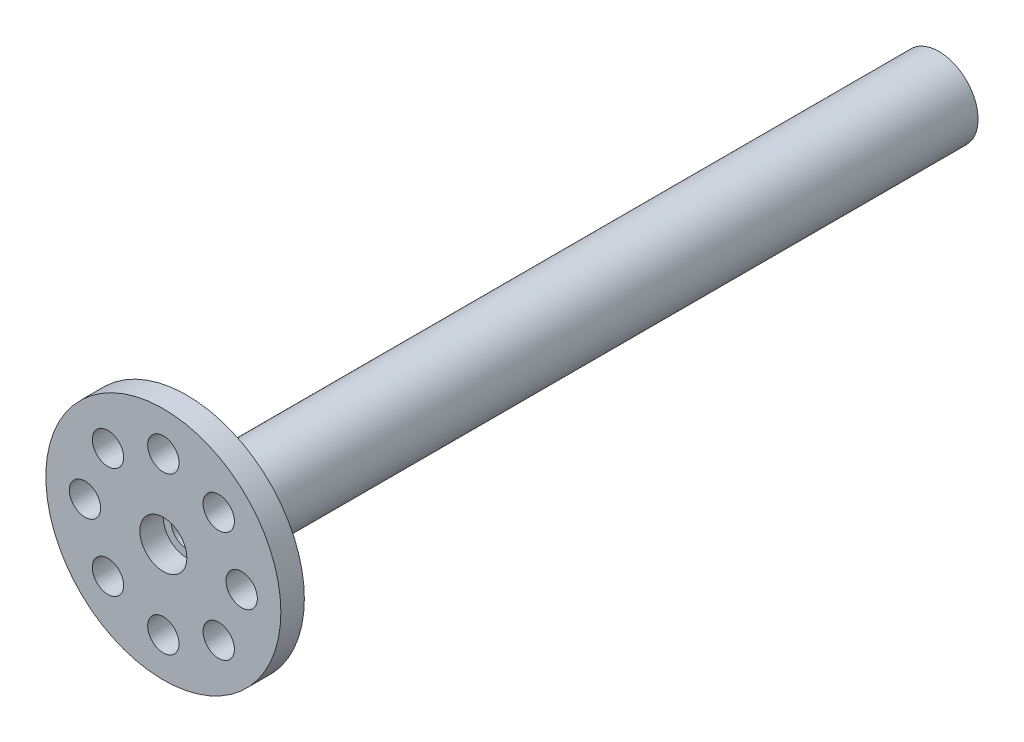
ISO-10303-21;
HEADER;
FILE_DESCRIPTION(('STEP AP214'),'2;1');
FILE_NAME('part.step','',(''),(''),'','','');
FILE_SCHEMA(('AUTOMOTIVE_DESIGN { 1 0 10303 214 1 1 1 1 }'));
ENDSEC;
DATA;
#1=APPLICATION_CONTEXT('core data for automotive mechanical design processes');
#2=APPLICATION_PROTOCOL_DEFINITION('international standard','automotive_design',2000,#1);
#3=PRODUCT_CONTEXT('',#1,'mechanical');
#4=PRODUCT('Part','Part','',(#3));
#5=PRODUCT_RELATED_PRODUCT_CATEGORY('part','',(#4));
#6=PRODUCT_DEFINITION_FORMATION('','',#4);
#7=PRODUCT_DEFINITION_CONTEXT('part definition',#1,'design');
#8=PRODUCT_DEFINITION('design','',#6,#7);
#9=PRODUCT_DEFINITION_SHAPE('','',#8);
#10=(LENGTH_UNIT() NAMED_UNIT(*) SI_UNIT(.MILLI.,.METRE.));
#11=(NAMED_UNIT(*) PLANE_ANGLE_UNIT() SI_UNIT($,.RADIAN.));
#12=(NAMED_UNIT(*) SI_UNIT($,.STERADIAN.) SOLID_ANGLE_UNIT());
#13=UNCERTAINTY_MEASURE_WITH_UNIT(LENGTH_MEASURE(1.E-05),#10,'distance_accuracy_value','');
#14=(GEOMETRIC_REPRESENTATION_CONTEXT(3) GLOBAL_UNCERTAINTY_ASSIGNED_CONTEXT((#13)) GLOBAL_UNIT_ASSIGNED_CONTEXT((#10,
#11,#12)) REPRESENTATION_CONTEXT('',''));
#15=CARTESIAN_POINT('',(0.,0.,0.));
#16=DIRECTION('',(0.,0.,1.));
#17=DIRECTION('',(1.,0.,0.));
#18=AXIS2_PLACEMENT_3D('',#15,#16,#17);
#19=CARTESIAN_POINT('',(0.,0.,99.));
#20=DIRECTION('',(0.,0.,-1.));
#21=DIRECTION('',(-1.,0.,0.));
#22=AXIS2_PLACEMENT_3D('',#19,#20,#21);
#23=CYLINDRICAL_SURFACE('',#22,2.);
#24=CARTESIAN_POINT('',(0.,0.,0.));
#25=DIRECTION('',(0.,0.,-1.));
#26=DIRECTION('',(-1.,0.,0.));
#27=AXIS2_PLACEMENT_3D('',#24,#25,#26);
#28=CIRCLE('',#27,2.);
#29=CARTESIAN_POINT('',(-2.,0.,0.));
#30=VERTEX_POINT('',#29);
#31=EDGE_CURVE('E107',#30,#30,#28,.T.);
#32=ORIENTED_EDGE('',*,*,#31,.T.);
#33=EDGE_LOOP('',(#32));
#34=FACE_BOUND('',#33,.T.);
#35=CARTESIAN_POINT('',(0.,0.,96.));
#36=DIRECTION('',(0.,0.,1.));
#37=DIRECTION('',(1.,0.,0.));
#38=AXIS2_PLACEMENT_3D('',#35,#36,#37);
#39=CIRCLE('',#38,2.);
#40=CARTESIAN_POINT('',(2.,0.,96.));
#41=VERTEX_POINT('',#40);
#42=EDGE_CURVE('E39',#41,#41,#39,.F.);
#43=ORIENTED_EDGE('',*,*,#42,.F.);
#44=EDGE_LOOP('',(#43));
#45=FACE_BOUND('',#44,.T.);
#46=ADVANCED_FACE('F35',(#34,#45),#23,.F.);
#47=CARTESIAN_POINT('',(0.,0.,93.));
#48=DIRECTION('',(0.,0.,-1.));
#49=DIRECTION('',(-1.,0.,0.));
#50=AXIS2_PLACEMENT_3D('',#47,#48,#49);
#51=CYLINDRICAL_SURFACE('',#50,5.);
#52=CARTESIAN_POINT('',(0.,0.,93.));
#53=DIRECTION('',(0.,0.,1.));
#54=DIRECTION('',(1.,0.,0.));
#55=AXIS2_PLACEMENT_3D('',#52,#53,#54);
#56=CIRCLE('',#55,5.);
#57=CARTESIAN_POINT('',(-5.,0.,93.));
#58=VERTEX_POINT('',#57);
#59=EDGE_CURVE('E10',#58,#58,#56,.T.);
#60=CARTESIAN_POINT('',(0.,0.,0.));
#61=DIRECTION('',(0.,0.,1.));
#62=DIRECTION('',(1.,0.,0.));
#63=AXIS2_PLACEMENT_3D('',#60,#61,#62);
#64=CIRCLE('',#63,5.);
#65=CARTESIAN_POINT('',(-5.,0.,0.));
#66=VERTEX_POINT('',#65);
#67=EDGE_CURVE('E43',#66,#66,#64,.T.);
#68=CARTESIAN_POINT('',(-5.,0.,93.));
#69=CARTESIAN_POINT('',(-5.,0.,92.03125));
#70=CARTESIAN_POINT('',(-5.,0.,91.0625));
#71=CARTESIAN_POINT('',(-5.,0.,89.125));
#72=CARTESIAN_POINT('',(-5.,0.,88.15625));
#73=CARTESIAN_POINT('',(-5.,0.,86.21875));
#74=CARTESIAN_POINT('',(-5.,0.,85.25));
#75=CARTESIAN_POINT('',(-5.,0.,83.3125));
#76=CARTESIAN_POINT('',(-5.,0.,82.34375));
#77=CARTESIAN_POINT('',(-5.,0.,80.40625));
#78=CARTESIAN_POINT('',(-5.,0.,79.4375));
#79=CARTESIAN_POINT('',(-5.,0.,77.5));
#80=CARTESIAN_POINT('',(-5.,0.,76.53125));
#81=CARTESIAN_POINT('',(-5.,0.,74.59375));
#82=CARTESIAN_POINT('',(-5.,0.,73.625));
#83=CARTESIAN_POINT('',(-5.,0.,71.6875));
#84=CARTESIAN_POINT('',(-5.,0.,70.71875));
#85=CARTESIAN_POINT('',(-5.,0.,68.78125));
#86=CARTESIAN_POINT('',(-5.,0.,67.8125));
#87=CARTESIAN_POINT('',(-5.,0.,65.875));
#88=CARTESIAN_POINT('',(-5.,0.,64.90625));
#89=CARTESIAN_POINT('',(-5.,0.,62.96875));
#90=CARTESIAN_POINT('',(-5.,0.,62.));
#91=CARTESIAN_POINT('',(-5.,0.,60.0625));
#92=CARTESIAN_POINT('',(-5.,0.,59.09375));
#93=CARTESIAN_POINT('',(-5.,0.,57.15625));
#94=CARTESIAN_POINT('',(-5.,0.,56.1875));
#95=CARTESIAN_POINT('',(-5.,0.,54.25));
#96=CARTESIAN_POINT('',(-5.,0.,53.28125));
#97=CARTESIAN_POINT('',(-5.,0.,51.34375));
#98=CARTESIAN_POINT('',(-5.,0.,50.375));
#99=CARTESIAN_POINT('',(-5.,0.,48.4375));
#100=CARTESIAN_POINT('',(-5.,0.,47.46875));
#101=CARTESIAN_POINT('',(-5.,0.,45.53125));
#102=CARTESIAN_POINT('',(-5.,0.,44.5625));
#103=CARTESIAN_POINT('',(-5.,0.,42.625));
#104=CARTESIAN_POINT('',(-5.,0.,41.65625));
#105=CARTESIAN_POINT('',(-5.,0.,39.71875));
#106=CARTESIAN_POINT('',(-5.,0.,38.75));
#107=CARTESIAN_POINT('',(-5.,0.,36.8125));
#108=CARTESIAN_POINT('',(-5.,0.,35.84375));
#109=CARTESIAN_POINT('',(-5.,0.,33.90625));
#110=CARTESIAN_POINT('',(-5.,0.,32.9375));
#111=CARTESIAN_POINT('',(-5.,0.,31.));
#112=CARTESIAN_POINT('',(-5.,0.,30.03125));
#113=CARTESIAN_POINT('',(-5.,0.,28.09375));
#114=CARTESIAN_POINT('',(-5.,0.,27.125));
#115=CARTESIAN_POINT('',(-5.,0.,25.1875));
#116=CARTESIAN_POINT('',(-5.,0.,24.21875));
#117=CARTESIAN_POINT('',(-5.,0.,22.28125));
#118=CARTESIAN_POINT('',(-5.,0.,21.3125));
#119=CARTESIAN_POINT('',(-5.,0.,19.375));
#120=CARTESIAN_POINT('',(-5.,0.,18.40625));
#121=CARTESIAN_POINT('',(-5.,0.,16.46875));
#122=CARTESIAN_POINT('',(-5.,0.,15.5));
#123=CARTESIAN_POINT('',(-5.,0.,13.5625));
#124=CARTESIAN_POINT('',(-5.,0.,12.59375));
#125=CARTESIAN_POINT('',(-5.,0.,10.65625));
#126=CARTESIAN_POINT('',(-5.,0.,9.68749999999998));
#127=CARTESIAN_POINT('',(-5.,0.,7.74999999999998));
#128=CARTESIAN_POINT('',(-5.,0.,6.78124999999998));
#129=CARTESIAN_POINT('',(-5.,0.,4.84374999999998));
#130=CARTESIAN_POINT('',(-5.,0.,3.87499999999999));
#131=CARTESIAN_POINT('',(-5.,0.,1.93749999999999));
#132=CARTESIAN_POINT('',(-5.,0.,0.968749999999985));
#133=CARTESIAN_POINT('',(-5.,0.,0.));
#134=B_SPLINE_CURVE_WITH_KNOTS('',3,(#68,#69,#70,#71,#72,#73,#74,#75,#76,#77,#78,#79,#80,#81,
#82,#83,#84,#85,#86,#87,#88,#89,#90,#91,#92,#93,#94,#95,#96,#97,#98,#99,#100,#101,#102,#103,
#104,#105,#106,#107,#108,#109,#110,#111,#112,#113,#114,#115,#116,#117,#118,#119,#120,#121,#122,
#123,#124,#125,#126,#127,#128,#129,#130,#131,#132,#133),.UNSPECIFIED.,.F.,.F.,(4,2,2,2,2,2,2,2,
2,2,2,2,2,2,2,2,2,2,2,2,2,2,2,2,2,2,2,2,2,2,2,2,4),(0.,2.90625000000001,5.81250000000001,
8.71875000000001,11.625,14.53125,17.4375,20.34375,23.25,26.15625,29.0625,31.96875,34.875,
37.78125,40.6875,43.59375,46.5,49.40625,52.3125,55.21875,58.125,61.03125,63.9375,66.84375,69.75,
72.65625,75.5625,78.46875,81.375,84.28125,87.1875,90.09375,93.),.UNSPECIFIED.);
#135=EDGE_CURVE('BSEAM37',#58,#66,#134,.T.);
#136=ORIENTED_EDGE('',*,*,#59,.F.);
#137=ORIENTED_EDGE('',*,*,#67,.T.);
#138=ORIENTED_EDGE('',*,*,#135,.T.);
#139=ORIENTED_EDGE('',*,*,#135,.F.);
#140=EDGE_LOOP('',(#136,#138,#137,#139));
#141=FACE_BOUND('',#140,.T.);
#142=ADVANCED_FACE('F37',(#141),#51,.T.);
#143=CARTESIAN_POINT('',(0.,0.,0.));
#144=DIRECTION('',(0.,0.,1.));
#145=DIRECTION('',(1.,0.,0.));
#146=AXIS2_PLACEMENT_3D('',#143,#144,#145);
#147=PLANE('',#146);
#148=ORIENTED_EDGE('',*,*,#31,.F.);
#149=EDGE_LOOP('',(#148));
#150=FACE_BOUND('',#149,.T.);
#151=ORIENTED_EDGE('',*,*,#67,.F.);
#152=EDGE_LOOP('',(#151));
#153=FACE_BOUND('',#152,.T.);
#154=ADVANCED_FACE('F130',(#150,#153),#147,.F.);
#155=CARTESIAN_POINT('',(0.,0.,96.));
#156=DIRECTION('',(0.,0.,-1.));
#157=DIRECTION('',(-1.,0.,0.));
#158=AXIS2_PLACEMENT_3D('',#155,#156,#157);
#159=CYLINDRICAL_SURFACE('',#158,6.);
#160=CARTESIAN_POINT('',(0.,0.,96.));
#161=DIRECTION('',(0.,0.,1.));
#162=DIRECTION('',(1.,0.,0.));
#163=AXIS2_PLACEMENT_3D('',#160,#161,#162);
#164=CIRCLE('',#163,6.);
#165=CARTESIAN_POINT('',(6.,0.,96.));
#166=VERTEX_POINT('',#165);
#167=EDGE_CURVE('E48',#166,#166,#164,.T.);
#168=ORIENTED_EDGE('',*,*,#167,.F.);
#169=EDGE_LOOP('',(#168));
#170=FACE_BOUND('',#169,.T.);
#171=CARTESIAN_POINT('',(0.,0.,93.));
#172=DIRECTION('',(0.,0.,1.));
#173=DIRECTION('',(1.,0.,0.));
#174=AXIS2_PLACEMENT_3D('',#171,#172,#173);
#175=CIRCLE('',#174,6.);
#176=CARTESIAN_POINT('',(6.,0.,93.));
#177=VERTEX_POINT('',#176);
#178=EDGE_CURVE('E50',#177,#177,#175,.T.);
#179=ORIENTED_EDGE('',*,*,#178,.T.);
#180=EDGE_LOOP('',(#179));
#181=FACE_BOUND('',#180,.T.);
#182=ADVANCED_FACE('F183',(#170,#181),#159,.T.);
#183=CARTESIAN_POINT('',(0.,0.,93.));
#184=DIRECTION('',(0.,0.,1.));
#185=DIRECTION('',(1.,0.,0.));
#186=AXIS2_PLACEMENT_3D('',#183,#184,#185);
#187=PLANE('',#186);
#188=ORIENTED_EDGE('',*,*,#59,.T.);
#189=EDGE_LOOP('',(#188));
#190=FACE_BOUND('',#189,.T.);
#191=ORIENTED_EDGE('',*,*,#178,.F.);
#192=EDGE_LOOP('',(#191));
#193=FACE_BOUND('',#192,.T.);
#194=ADVANCED_FACE('F173',(#190,#193),#187,.F.);
#195=CARTESIAN_POINT('',(0.,0.,99.));
#196=DIRECTION('',(0.,0.,1.));
#197=DIRECTION('',(1.,0.,0.));
#198=AXIS2_PLACEMENT_3D('',#195,#196,#197);
#199=PLANE('',#198);
#200=CARTESIAN_POINT('',(0.,0.,99.));
#201=DIRECTION('',(0.,0.,1.));
#202=DIRECTION('',(1.,0.,0.));
#203=AXIS2_PLACEMENT_3D('',#200,#201,#202);
#204=CIRCLE('',#203,3.);
#205=CARTESIAN_POINT('',(3.,0.,99.));
#206=VERTEX_POINT('',#205);
#207=EDGE_CURVE('E112',#206,#206,#204,.T.);
#208=ORIENTED_EDGE('',*,*,#207,.F.);
#209=EDGE_LOOP('',(#208));
#210=FACE_BOUND('',#209,.T.);
#211=CARTESIAN_POINT('',(-7.07106781186512,-7.07106781186583,99.));
#212=DIRECTION('',(0.,0.,1.));
#213=DIRECTION('',(1.,0.,0.));
#214=AXIS2_PLACEMENT_3D('',#211,#212,#213);
#215=CIRCLE('',#214,2.00000000000029);
#216=CARTESIAN_POINT('',(-5.07106781186483,-7.07106781186583,99.));
#217=VERTEX_POINT('',#216);
#218=EDGE_CURVE('E95',#217,#217,#215,.T.);
#219=ORIENTED_EDGE('',*,*,#218,.F.);
#220=EDGE_LOOP('',(#219));
#221=FACE_BOUND('',#220,.T.);
#222=CARTESIAN_POINT('',(7.07106781186551,7.07106781186544,99.));
#223=DIRECTION('',(0.,0.,1.));
#224=DIRECTION('',(1.,0.,0.));
#225=AXIS2_PLACEMENT_3D('',#222,#223,#224);
#226=CIRCLE('',#225,2.);
#227=CARTESIAN_POINT('',(9.07106781186551,7.07106781186544,99.));
#228=VERTEX_POINT('',#227);
#229=EDGE_CURVE('E83',#228,#228,#226,.T.);
#230=ORIENTED_EDGE('',*,*,#229,.F.);
#231=EDGE_LOOP('',(#230));
#232=FACE_BOUND('',#231,.T.);
#233=CARTESIAN_POINT('',(0.,-10.,99.));
#234=DIRECTION('',(0.,0.,1.));
#235=DIRECTION('',(1.,0.,0.));
#236=AXIS2_PLACEMENT_3D('',#233,#234,#235);
#237=CIRCLE('',#236,2.);
#238=CARTESIAN_POINT('',(2.,-10.,99.));
#239=VERTEX_POINT('',#238);
#240=EDGE_CURVE('E71',#239,#239,#237,.T.);
#241=ORIENTED_EDGE('',*,*,#240,.F.);
#242=EDGE_LOOP('',(#241));
#243=FACE_BOUND('',#242,.T.);
#244=CARTESIAN_POINT('',(0.,10.,99.));
#245=DIRECTION('',(0.,0.,1.));
#246=DIRECTION('',(1.,0.,0.));
#247=AXIS2_PLACEMENT_3D('',#244,#245,#246);
#248=CIRCLE('',#247,2.);
#249=CARTESIAN_POINT('',(2.,10.,99.));
#250=VERTEX_POINT('',#249);
#251=EDGE_CURVE('E59',#250,#250,#248,.T.);
#252=ORIENTED_EDGE('',*,*,#251,.F.);
#253=EDGE_LOOP('',(#252));
#254=FACE_BOUND('',#253,.T.);
#255=CARTESIAN_POINT('',(0.,0.,99.));
#256=DIRECTION('',(0.,0.,1.));
#257=DIRECTION('',(1.,0.,0.));
#258=AXIS2_PLACEMENT_3D('',#255,#256,#257);
#259=CIRCLE('',#258,15.);
#260=CARTESIAN_POINT('',(15.,0.,99.));
#261=VERTEX_POINT('',#260);
#262=EDGE_CURVE('E53',#261,#261,#259,.T.);
#263=ORIENTED_EDGE('',*,*,#262,.T.);
#264=EDGE_LOOP('',(#263));
#265=FACE_BOUND('',#264,.T.);
#266=CARTESIAN_POINT('',(10.,0.,99.));
#267=DIRECTION('',(0.,0.,1.));
#268=DIRECTION('',(1.,0.,0.));
#269=AXIS2_PLACEMENT_3D('',#266,#267,#268);
#270=CIRCLE('',#269,2.);
#271=CARTESIAN_POINT('',(12.,0.,99.));
#272=VERTEX_POINT('',#271);
#273=EDGE_CURVE('E65',#272,#272,#270,.T.);
#274=ORIENTED_EDGE('',*,*,#273,.F.);
#275=EDGE_LOOP('',(#274));
#276=FACE_BOUND('',#275,.T.);
#277=CARTESIAN_POINT('',(-10.,0.,99.));
#278=DIRECTION('',(0.,0.,1.));
#279=DIRECTION('',(1.,0.,0.));
#280=AXIS2_PLACEMENT_3D('',#277,#278,#279);
#281=CIRCLE('',#280,2.);
#282=CARTESIAN_POINT('',(-8.,0.,99.));
#283=VERTEX_POINT('',#282);
#284=EDGE_CURVE('E77',#283,#283,#281,.T.);
#285=ORIENTED_EDGE('',*,*,#284,.F.);
#286=EDGE_LOOP('',(#285));
#287=FACE_BOUND('',#286,.T.);
#288=CARTESIAN_POINT('',(7.07106781186583,-7.07106781186551,99.));
#289=DIRECTION('',(0.,0.,1.));
#290=DIRECTION('',(1.,0.,0.));
#291=AXIS2_PLACEMENT_3D('',#288,#289,#290);
#292=CIRCLE('',#291,1.9999999999999);
#293=CARTESIAN_POINT('',(9.07106781186573,-7.07106781186551,99.));
#294=VERTEX_POINT('',#293);
#295=EDGE_CURVE('E89',#294,#294,#292,.T.);
#296=ORIENTED_EDGE('',*,*,#295,.F.);
#297=EDGE_LOOP('',(#296));
#298=FACE_BOUND('',#297,.T.);
#299=CARTESIAN_POINT('',(-7.07106781186544,7.07106781186512,99.));
#300=DIRECTION('',(0.,0.,1.));
#301=DIRECTION('',(1.,0.,0.));
#302=AXIS2_PLACEMENT_3D('',#299,#300,#301);
#303=CIRCLE('',#302,2.00000000000043);
#304=CARTESIAN_POINT('',(-5.07106781186501,7.07106781186512,99.));
#305=VERTEX_POINT('',#304);
#306=EDGE_CURVE('E101',#305,#305,#303,.T.);
#307=ORIENTED_EDGE('',*,*,#306,.F.);
#308=EDGE_LOOP('',(#307));
#309=FACE_BOUND('',#308,.T.);
#310=ADVANCED_FACE('F169',(#210,#221,#232,#243,#254,#265,#276,#287,#298,#309),#199,.T.);
#311=CARTESIAN_POINT('',(0.,0.,96.));
#312=DIRECTION('',(0.,0.,1.));
#313=DIRECTION('',(1.,0.,0.));
#314=AXIS2_PLACEMENT_3D('',#311,#312,#313);
#315=PLANE('',#314);
#316=ORIENTED_EDGE('',*,*,#167,.T.);
#317=EDGE_LOOP('',(#316));
#318=FACE_BOUND('',#317,.T.);
#319=CARTESIAN_POINT('',(0.,0.,96.));
#320=DIRECTION('',(0.,0.,1.));
#321=DIRECTION('',(1.,0.,0.));
#322=AXIS2_PLACEMENT_3D('',#319,#320,#321);
#323=CIRCLE('',#322,15.);
#324=CARTESIAN_POINT('',(15.,0.,96.));
#325=VERTEX_POINT('',#324);
#326=EDGE_CURVE('E56',#325,#325,#323,.T.);
#327=ORIENTED_EDGE('',*,*,#326,.F.);
#328=EDGE_LOOP('',(#327));
#329=FACE_BOUND('',#328,.T.);
#330=CARTESIAN_POINT('',(0.,10.,96.));
#331=DIRECTION('',(0.,0.,1.));
#332=DIRECTION('',(1.,0.,0.));
#333=AXIS2_PLACEMENT_3D('',#330,#331,#332);
#334=CIRCLE('',#333,2.);
#335=CARTESIAN_POINT('',(2.,10.,96.));
#336=VERTEX_POINT('',#335);
#337=EDGE_CURVE('E62',#336,#336,#334,.T.);
#338=ORIENTED_EDGE('',*,*,#337,.T.);
#339=EDGE_LOOP('',(#338));
#340=FACE_BOUND('',#339,.T.);
#341=CARTESIAN_POINT('',(10.,0.,96.));
#342=DIRECTION('',(0.,0.,1.));
#343=DIRECTION('',(1.,0.,0.));
#344=AXIS2_PLACEMENT_3D('',#341,#342,#343);
#345=CIRCLE('',#344,2.);
#346=CARTESIAN_POINT('',(12.,0.,96.));
#347=VERTEX_POINT('',#346);
#348=EDGE_CURVE('E68',#347,#347,#345,.T.);
#349=ORIENTED_EDGE('',*,*,#348,.T.);
#350=EDGE_LOOP('',(#349));
#351=FACE_BOUND('',#350,.T.);
#352=CARTESIAN_POINT('',(0.,-10.,96.));
#353=DIRECTION('',(0.,0.,1.));
#354=DIRECTION('',(1.,0.,0.));
#355=AXIS2_PLACEMENT_3D('',#352,#353,#354);
#356=CIRCLE('',#355,2.);
#357=CARTESIAN_POINT('',(2.,-10.,96.));
#358=VERTEX_POINT('',#357);
#359=EDGE_CURVE('E74',#358,#358,#356,.T.);
#360=ORIENTED_EDGE('',*,*,#359,.T.);
#361=EDGE_LOOP('',(#360));
#362=FACE_BOUND('',#361,.T.);
#363=CARTESIAN_POINT('',(-10.,0.,96.));
#364=DIRECTION('',(0.,0.,1.));
#365=DIRECTION('',(1.,0.,0.));
#366=AXIS2_PLACEMENT_3D('',#363,#364,#365);
#367=CIRCLE('',#366,2.);
#368=CARTESIAN_POINT('',(-8.,0.,96.));
#369=VERTEX_POINT('',#368);
#370=EDGE_CURVE('E80',#369,#369,#367,.T.);
#371=ORIENTED_EDGE('',*,*,#370,.T.);
#372=EDGE_LOOP('',(#371));
#373=FACE_BOUND('',#372,.T.);
#374=CARTESIAN_POINT('',(7.07106781186551,7.07106781186544,96.));
#375=DIRECTION('',(0.,0.,1.));
#376=DIRECTION('',(1.,0.,0.));
#377=AXIS2_PLACEMENT_3D('',#374,#375,#376);
#378=CIRCLE('',#377,2.);
#379=CARTESIAN_POINT('',(9.07106781186551,7.07106781186544,96.));
#380=VERTEX_POINT('',#379);
#381=EDGE_CURVE('E86',#380,#380,#378,.T.);
#382=ORIENTED_EDGE('',*,*,#381,.T.);
#383=EDGE_LOOP('',(#382));
#384=FACE_BOUND('',#383,.T.);
#385=CARTESIAN_POINT('',(7.07106781186583,-7.07106781186551,96.));
#386=DIRECTION('',(0.,0.,1.));
#387=DIRECTION('',(1.,0.,0.));
#388=AXIS2_PLACEMENT_3D('',#385,#386,#387);
#389=CIRCLE('',#388,1.9999999999999);
#390=CARTESIAN_POINT('',(9.07106781186573,-7.07106781186551,96.));
#391=VERTEX_POINT('',#390);
#392=EDGE_CURVE('E92',#391,#391,#389,.T.);
#393=ORIENTED_EDGE('',*,*,#392,.T.);
#394=EDGE_LOOP('',(#393));
#395=FACE_BOUND('',#394,.T.);
#396=CARTESIAN_POINT('',(-7.07106781186512,-7.07106781186583,96.));
#397=DIRECTION('',(0.,0.,1.));
#398=DIRECTION('',(1.,0.,0.));
#399=AXIS2_PLACEMENT_3D('',#396,#397,#398);
#400=CIRCLE('',#399,2.00000000000029);
#401=CARTESIAN_POINT('',(-5.07106781186483,-7.07106781186583,96.));
#402=VERTEX_POINT('',#401);
#403=EDGE_CURVE('E98',#402,#402,#400,.T.);
#404=ORIENTED_EDGE('',*,*,#403,.T.);
#405=EDGE_LOOP('',(#404));
#406=FACE_BOUND('',#405,.T.);
#407=CARTESIAN_POINT('',(-7.07106781186544,7.07106781186512,96.));
#408=DIRECTION('',(0.,0.,1.));
#409=DIRECTION('',(1.,0.,0.));
#410=AXIS2_PLACEMENT_3D('',#407,#408,#409);
#411=CIRCLE('',#410,2.00000000000043);
#412=CARTESIAN_POINT('',(-5.07106781186501,7.07106781186512,96.));
#413=VERTEX_POINT('',#412);
#414=EDGE_CURVE('E104',#413,#413,#411,.T.);
#415=ORIENTED_EDGE('',*,*,#414,.T.);
#416=EDGE_LOOP('',(#415));
#417=FACE_BOUND('',#416,.T.);
#418=ADVANCED_FACE('F172',(#318,#329,#340,#351,#362,#373,#384,#395,#406,#417),#315,.F.);
#419=CARTESIAN_POINT('',(0.,0.,99.));
#420=DIRECTION('',(0.,0.,-1.));
#421=DIRECTION('',(-1.,0.,0.));
#422=AXIS2_PLACEMENT_3D('',#419,#420,#421);
#423=CYLINDRICAL_SURFACE('',#422,15.);
#424=ORIENTED_EDGE('',*,*,#262,.F.);
#425=EDGE_LOOP('',(#424));
#426=FACE_BOUND('',#425,.T.);
#427=ORIENTED_EDGE('',*,*,#326,.T.);
#428=EDGE_LOOP('',(#427));
#429=FACE_BOUND('',#428,.T.);
#430=ADVANCED_FACE('F167',(#426,#429),#423,.T.);
#431=CARTESIAN_POINT('',(0.,10.,99.));
#432=DIRECTION('',(0.,0.,-1.));
#433=DIRECTION('',(-1.,0.,0.));
#434=AXIS2_PLACEMENT_3D('',#431,#432,#433);
#435=CYLINDRICAL_SURFACE('',#434,2.);
#436=ORIENTED_EDGE('',*,*,#251,.T.);
#437=EDGE_LOOP('',(#436));
#438=FACE_BOUND('',#437,.T.);
#439=ORIENTED_EDGE('',*,*,#337,.F.);
#440=EDGE_LOOP('',(#439));
#441=FACE_BOUND('',#440,.T.);
#442=ADVANCED_FACE('F163',(#438,#441),#435,.F.);
#443=CARTESIAN_POINT('',(10.,0.,99.));
#444=DIRECTION('',(0.,0.,-1.));
#445=DIRECTION('',(-1.,0.,0.));
#446=AXIS2_PLACEMENT_3D('',#443,#444,#445);
#447=CYLINDRICAL_SURFACE('',#446,2.);
#448=ORIENTED_EDGE('',*,*,#273,.T.);
#449=EDGE_LOOP('',(#448));
#450=FACE_BOUND('',#449,.T.);
#451=ORIENTED_EDGE('',*,*,#348,.F.);
#452=EDGE_LOOP('',(#451));
#453=FACE_BOUND('',#452,.T.);
#454=ADVANCED_FACE('F159',(#450,#453),#447,.F.);
#455=CARTESIAN_POINT('',(0.,-10.,99.));
#456=DIRECTION('',(0.,0.,-1.));
#457=DIRECTION('',(-1.,0.,0.));
#458=AXIS2_PLACEMENT_3D('',#455,#456,#457);
#459=CYLINDRICAL_SURFACE('',#458,2.);
#460=ORIENTED_EDGE('',*,*,#240,.T.);
#461=EDGE_LOOP('',(#460));
#462=FACE_BOUND('',#461,.T.);
#463=ORIENTED_EDGE('',*,*,#359,.F.);
#464=EDGE_LOOP('',(#463));
#465=FACE_BOUND('',#464,.T.);
#466=ADVANCED_FACE('F155',(#462,#465),#459,.F.);
#467=CARTESIAN_POINT('',(-10.,0.,99.));
#468=DIRECTION('',(0.,0.,-1.));
#469=DIRECTION('',(-1.,0.,0.));
#470=AXIS2_PLACEMENT_3D('',#467,#468,#469);
#471=CYLINDRICAL_SURFACE('',#470,2.);
#472=ORIENTED_EDGE('',*,*,#284,.T.);
#473=EDGE_LOOP('',(#472));
#474=FACE_BOUND('',#473,.T.);
#475=ORIENTED_EDGE('',*,*,#370,.F.);
#476=EDGE_LOOP('',(#475));
#477=FACE_BOUND('',#476,.T.);
#478=ADVANCED_FACE('F151',(#474,#477),#471,.F.);
#479=CARTESIAN_POINT('',(7.07106781186551,7.07106781186544,99.));
#480=DIRECTION('',(0.,0.,-1.));
#481=DIRECTION('',(-1.,0.,0.));
#482=AXIS2_PLACEMENT_3D('',#479,#480,#481);
#483=CYLINDRICAL_SURFACE('',#482,2.);
#484=ORIENTED_EDGE('',*,*,#229,.T.);
#485=EDGE_LOOP('',(#484));
#486=FACE_BOUND('',#485,.T.);
#487=ORIENTED_EDGE('',*,*,#381,.F.);
#488=EDGE_LOOP('',(#487));
#489=FACE_BOUND('',#488,.T.);
#490=ADVANCED_FACE('F147',(#486,#489),#483,.F.);
#491=CARTESIAN_POINT('',(7.07106781186583,-7.07106781186551,99.));
#492=DIRECTION('',(0.,0.,-1.));
#493=DIRECTION('',(-1.,0.,0.));
#494=AXIS2_PLACEMENT_3D('',#491,#492,#493);
#495=CYLINDRICAL_SURFACE('',#494,1.9999999999999);
#496=ORIENTED_EDGE('',*,*,#295,.T.);
#497=EDGE_LOOP('',(#496));
#498=FACE_BOUND('',#497,.T.);
#499=ORIENTED_EDGE('',*,*,#392,.F.);
#500=EDGE_LOOP('',(#499));
#501=FACE_BOUND('',#500,.T.);
#502=ADVANCED_FACE('F143',(#498,#501),#495,.F.);
#503=CARTESIAN_POINT('',(-7.07106781186512,-7.07106781186583,99.));
#504=DIRECTION('',(0.,0.,-1.));
#505=DIRECTION('',(-1.,0.,0.));
#506=AXIS2_PLACEMENT_3D('',#503,#504,#505);
#507=CYLINDRICAL_SURFACE('',#506,2.00000000000029);
#508=ORIENTED_EDGE('',*,*,#218,.T.);
#509=EDGE_LOOP('',(#508));
#510=FACE_BOUND('',#509,.T.);
#511=ORIENTED_EDGE('',*,*,#403,.F.);
#512=EDGE_LOOP('',(#511));
#513=FACE_BOUND('',#512,.T.);
#514=ADVANCED_FACE('F139',(#510,#513),#507,.F.);
#515=CARTESIAN_POINT('',(-7.07106781186544,7.07106781186512,99.));
#516=DIRECTION('',(0.,0.,-1.));
#517=DIRECTION('',(-1.,0.,0.));
#518=AXIS2_PLACEMENT_3D('',#515,#516,#517);
#519=CYLINDRICAL_SURFACE('',#518,2.00000000000043);
#520=ORIENTED_EDGE('',*,*,#306,.T.);
#521=EDGE_LOOP('',(#520));
#522=FACE_BOUND('',#521,.T.);
#523=ORIENTED_EDGE('',*,*,#414,.F.);
#524=EDGE_LOOP('',(#523));
#525=FACE_BOUND('',#524,.T.);
#526=ADVANCED_FACE('F136',(#522,#525),#519,.F.);
#527=CARTESIAN_POINT('',(0.,0.,96.));
#528=DIRECTION('',(0.,0.,1.));
#529=DIRECTION('',(1.,0.,0.));
#530=AXIS2_PLACEMENT_3D('',#527,#528,#529);
#531=PLANE('',#530);
#532=CARTESIAN_POINT('',(0.,0.,96.));
#533=DIRECTION('',(0.,0.,1.));
#534=DIRECTION('',(1.,0.,0.));
#535=AXIS2_PLACEMENT_3D('',#532,#533,#534);
#536=CIRCLE('',#535,3.);
#537=CARTESIAN_POINT('',(3.,0.,96.));
#538=VERTEX_POINT('',#537);
#539=EDGE_CURVE('E115',#538,#538,#536,.T.);
#540=ORIENTED_EDGE('',*,*,#539,.T.);
#541=EDGE_LOOP('',(#540));
#542=FACE_BOUND('',#541,.T.);
#543=ORIENTED_EDGE('',*,*,#42,.T.);
#544=EDGE_LOOP('',(#543));
#545=FACE_BOUND('',#544,.T.);
#546=ADVANCED_FACE('F122',(#542,#545),#531,.T.);
#547=CARTESIAN_POINT('',(0.,0.,96.));
#548=DIRECTION('',(0.,0.,1.));
#549=DIRECTION('',(1.,0.,0.));
#550=AXIS2_PLACEMENT_3D('',#547,#548,#549);
#551=CYLINDRICAL_SURFACE('',#550,3.);
#552=ORIENTED_EDGE('',*,*,#539,.F.);
#553=EDGE_LOOP('',(#552));
#554=FACE_BOUND('',#553,.T.);
#555=ORIENTED_EDGE('',*,*,#207,.T.);
#556=EDGE_LOOP('',(#555));
#557=FACE_BOUND('',#556,.T.);
#558=ADVANCED_FACE('F134',(#554,#557),#551,.F.);
#559=CLOSED_SHELL('',(#46,#142,#154,#182,#194,#310,#418,#430,#442,#454,#466,#478,#490,#502,#514,
#526,#546,#558));
#560=MANIFOLD_SOLID_BREP('B2',#559);
#561=ADVANCED_BREP_SHAPE_REPRESENTATION('',(#18,#560),#14);
#562=SHAPE_DEFINITION_REPRESENTATION(#9,#561);
ENDSEC;
END-ISO-10303-21;
